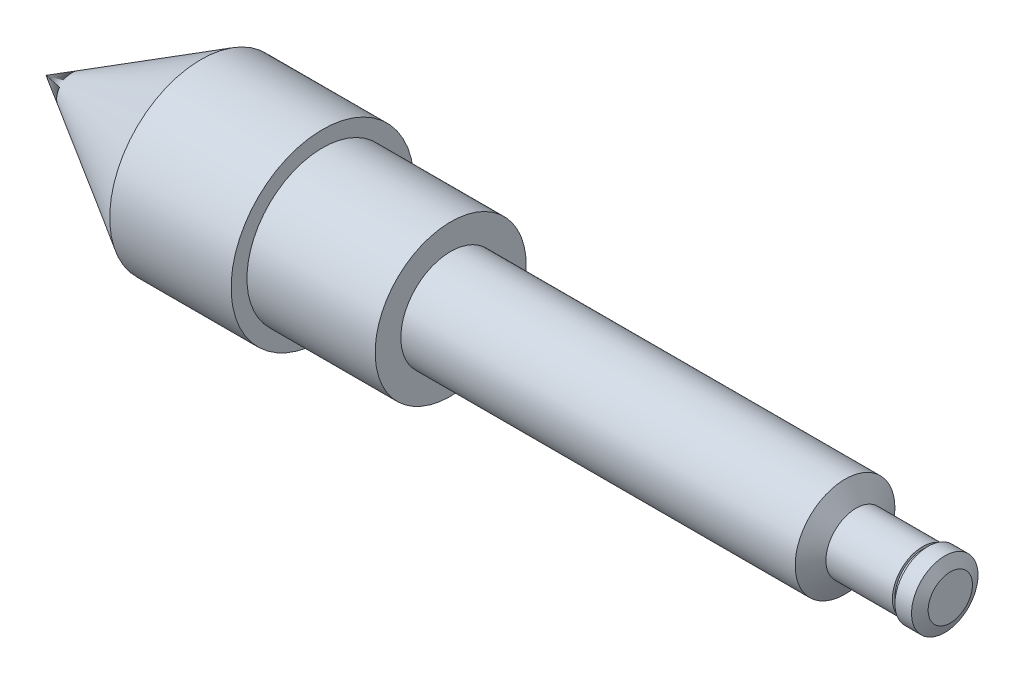
ISO-10303-21;
HEADER;
FILE_DESCRIPTION(('STEP AP214'),'2;1');
FILE_NAME('part.step','',(''),(''),'','','');
FILE_SCHEMA(('AUTOMOTIVE_DESIGN { 1 0 10303 214 1 1 1 1 }'));
ENDSEC;
DATA;
#1=APPLICATION_CONTEXT('core data for automotive mechanical design processes');
#2=APPLICATION_PROTOCOL_DEFINITION('international standard','automotive_design',2000,#1);
#3=PRODUCT_CONTEXT('',#1,'mechanical');
#4=PRODUCT('Part','Part','',(#3));
#5=PRODUCT_RELATED_PRODUCT_CATEGORY('part','',(#4));
#6=PRODUCT_DEFINITION_FORMATION('','',#4);
#7=PRODUCT_DEFINITION_CONTEXT('part definition',#1,'design');
#8=PRODUCT_DEFINITION('design','',#6,#7);
#9=PRODUCT_DEFINITION_SHAPE('','',#8);
#10=(LENGTH_UNIT() NAMED_UNIT(*) SI_UNIT(.MILLI.,.METRE.));
#11=(NAMED_UNIT(*) PLANE_ANGLE_UNIT() SI_UNIT($,.RADIAN.));
#12=(NAMED_UNIT(*) SI_UNIT($,.STERADIAN.) SOLID_ANGLE_UNIT());
#13=UNCERTAINTY_MEASURE_WITH_UNIT(LENGTH_MEASURE(1.E-05),#10,'distance_accuracy_value','');
#14=(GEOMETRIC_REPRESENTATION_CONTEXT(3) GLOBAL_UNCERTAINTY_ASSIGNED_CONTEXT((#13)) GLOBAL_UNIT_ASSIGNED_CONTEXT((#10,
#11,#12)) REPRESENTATION_CONTEXT('',''));
#15=CARTESIAN_POINT('',(0.,0.,0.));
#16=DIRECTION('',(0.,0.,1.));
#17=DIRECTION('',(1.,0.,0.));
#18=AXIS2_PLACEMENT_3D('',#15,#16,#17);
#19=CARTESIAN_POINT('',(148.75,0.,0.));
#20=DIRECTION('',(1.,0.,0.));
#21=DIRECTION('',(0.,0.,-1.));
#22=AXIS2_PLACEMENT_3D('',#19,#20,#21);
#23=CYLINDRICAL_SURFACE('',#22,18.15);
#24=CARTESIAN_POINT('',(24.1,0.,0.));
#25=DIRECTION('',(1.,0.,0.));
#26=DIRECTION('',(0.,0.,-1.));
#27=AXIS2_PLACEMENT_3D('',#24,#25,#26);
#28=CIRCLE('',#27,18.15);
#29=CARTESIAN_POINT('',(24.1,0.,-18.15));
#30=VERTEX_POINT('',#29);
#31=EDGE_CURVE('E11',#30,#30,#28,.T.);
#32=ORIENTED_EDGE('',*,*,#31,.F.);
#33=EDGE_LOOP('',(#32));
#34=FACE_BOUND('',#33,.T.);
#35=CARTESIAN_POINT('',(0.,0.,0.));
#36=DIRECTION('',(1.,0.,0.));
#37=DIRECTION('',(0.,0.,-1.));
#38=AXIS2_PLACEMENT_3D('',#35,#36,#37);
#39=CIRCLE('',#38,18.15);
#40=CARTESIAN_POINT('',(0.,0.,-18.15));
#41=VERTEX_POINT('',#40);
#42=EDGE_CURVE('E67',#41,#41,#39,.T.);
#43=ORIENTED_EDGE('',*,*,#42,.T.);
#44=EDGE_LOOP('',(#43));
#45=FACE_BOUND('',#44,.T.);
#46=ADVANCED_FACE('F35',(#34,#45),#23,.T.);
#47=CARTESIAN_POINT('',(24.1,0.,18.15));
#48=DIRECTION('',(-1.,0.,0.));
#49=DIRECTION('',(0.,0.,1.));
#50=AXIS2_PLACEMENT_3D('',#47,#48,#49);
#51=PLANE('',#50);
#52=CARTESIAN_POINT('',(24.1,0.,0.));
#53=DIRECTION('',(1.,0.,0.));
#54=DIRECTION('',(0.,0.,-1.));
#55=AXIS2_PLACEMENT_3D('',#52,#53,#54);
#56=CIRCLE('',#55,15.);
#57=CARTESIAN_POINT('',(24.1,0.,-15.));
#58=VERTEX_POINT('',#57);
#59=EDGE_CURVE('E41',#58,#58,#56,.T.);
#60=ORIENTED_EDGE('',*,*,#59,.F.);
#61=EDGE_LOOP('',(#60));
#62=FACE_BOUND('',#61,.T.);
#63=ORIENTED_EDGE('',*,*,#31,.T.);
#64=EDGE_LOOP('',(#63));
#65=FACE_BOUND('',#64,.T.);
#66=ADVANCED_FACE('F57',(#62,#65),#51,.F.);
#67=CARTESIAN_POINT('',(148.75,0.,0.));
#68=DIRECTION('',(1.,0.,0.));
#69=DIRECTION('',(0.,0.,-1.));
#70=AXIS2_PLACEMENT_3D('',#67,#68,#69);
#71=CYLINDRICAL_SURFACE('',#70,15.);
#72=CARTESIAN_POINT('',(49.55,0.,0.));
#73=DIRECTION('',(1.,0.,0.));
#74=DIRECTION('',(0.,0.,-1.));
#75=AXIS2_PLACEMENT_3D('',#72,#73,#74);
#76=CIRCLE('',#75,15.);
#77=CARTESIAN_POINT('',(49.55,0.,-15.));
#78=VERTEX_POINT('',#77);
#79=EDGE_CURVE('E97',#78,#78,#76,.T.);
#80=ORIENTED_EDGE('',*,*,#79,.F.);
#81=EDGE_LOOP('',(#80));
#82=FACE_BOUND('',#81,.T.);
#83=ORIENTED_EDGE('',*,*,#59,.T.);
#84=EDGE_LOOP('',(#83));
#85=FACE_BOUND('',#84,.T.);
#86=ADVANCED_FACE('F62',(#82,#85),#71,.T.);
#87=CARTESIAN_POINT('',(49.55,0.,9.90000000000004));
#88=DIRECTION('',(-1.,0.,0.));
#89=DIRECTION('',(0.,0.,1.));
#90=AXIS2_PLACEMENT_3D('',#87,#88,#89);
#91=PLANE('',#90);
#92=CARTESIAN_POINT('',(49.55,0.,0.));
#93=DIRECTION('',(1.,0.,0.));
#94=DIRECTION('',(0.,0.,-1.));
#95=AXIS2_PLACEMENT_3D('',#92,#93,#94);
#96=CIRCLE('',#95,9.90000000000004);
#97=CARTESIAN_POINT('',(49.55,0.,-9.90000000000004));
#98=VERTEX_POINT('',#97);
#99=EDGE_CURVE('E94',#98,#98,#96,.T.);
#100=ORIENTED_EDGE('',*,*,#99,.F.);
#101=EDGE_LOOP('',(#100));
#102=FACE_BOUND('',#101,.T.);
#103=ORIENTED_EDGE('',*,*,#79,.T.);
#104=EDGE_LOOP('',(#103));
#105=FACE_BOUND('',#104,.T.);
#106=ADVANCED_FACE('F104',(#102,#105),#91,.F.);
#107=CARTESIAN_POINT('',(148.75,0.,0.));
#108=DIRECTION('',(1.,0.,0.));
#109=DIRECTION('',(0.,0.,-1.));
#110=AXIS2_PLACEMENT_3D('',#107,#108,#109);
#111=CYLINDRICAL_SURFACE('',#110,9.90000000000004);
#112=CARTESIAN_POINT('',(127.85,0.,0.));
#113=DIRECTION('',(1.,0.,0.));
#114=DIRECTION('',(0.,0.,-1.));
#115=AXIS2_PLACEMENT_3D('',#112,#113,#114);
#116=CIRCLE('',#115,9.90000000000004);
#117=CARTESIAN_POINT('',(127.85,0.,-9.90000000000004));
#118=VERTEX_POINT('',#117);
#119=EDGE_CURVE('E91',#118,#118,#116,.T.);
#120=ORIENTED_EDGE('',*,*,#119,.F.);
#121=EDGE_LOOP('',(#120));
#122=FACE_BOUND('',#121,.T.);
#123=ORIENTED_EDGE('',*,*,#99,.T.);
#124=EDGE_LOOP('',(#123));
#125=FACE_BOUND('',#124,.T.);
#126=ADVANCED_FACE('F110',(#122,#125),#111,.T.);
#127=CARTESIAN_POINT('',(127.85,0.,0.));
#128=DIRECTION('',(-1.,0.,0.));
#129=DIRECTION('',(0.,0.,1.));
#130=AXIS2_PLACEMENT_3D('',#127,#128,#129);
#131=CONICAL_SURFACE('',#130,9.90000000000004,1.05719032207216);
#132=CARTESIAN_POINT('',(130.05,0.,0.));
#133=DIRECTION('',(1.,0.,0.));
#134=DIRECTION('',(0.,0.,-1.));
#135=AXIS2_PLACEMENT_3D('',#132,#133,#134);
#136=CIRCLE('',#135,6.);
#137=CARTESIAN_POINT('',(130.05,0.,-6.));
#138=VERTEX_POINT('',#137);
#139=EDGE_CURVE('E88',#138,#138,#136,.T.);
#140=ORIENTED_EDGE('',*,*,#139,.F.);
#141=EDGE_LOOP('',(#140));
#142=FACE_BOUND('',#141,.T.);
#143=ORIENTED_EDGE('',*,*,#119,.T.);
#144=EDGE_LOOP('',(#143));
#145=FACE_BOUND('',#144,.T.);
#146=ADVANCED_FACE('F117',(#142,#145),#131,.T.);
#147=CARTESIAN_POINT('',(148.75,0.,0.));
#148=DIRECTION('',(1.,0.,0.));
#149=DIRECTION('',(0.,0.,-1.));
#150=AXIS2_PLACEMENT_3D('',#147,#148,#149);
#151=CYLINDRICAL_SURFACE('',#150,6.);
#152=CARTESIAN_POINT('',(143.25,0.,0.));
#153=DIRECTION('',(1.,0.,0.));
#154=DIRECTION('',(0.,0.,-1.));
#155=AXIS2_PLACEMENT_3D('',#152,#153,#154);
#156=CIRCLE('',#155,6.);
#157=CARTESIAN_POINT('',(143.25,0.,-6.));
#158=VERTEX_POINT('',#157);
#159=EDGE_CURVE('E85',#158,#158,#156,.T.);
#160=ORIENTED_EDGE('',*,*,#159,.F.);
#161=EDGE_LOOP('',(#160));
#162=FACE_BOUND('',#161,.T.);
#163=ORIENTED_EDGE('',*,*,#139,.T.);
#164=EDGE_LOOP('',(#163));
#165=FACE_BOUND('',#164,.T.);
#166=ADVANCED_FACE('F121',(#162,#165),#151,.T.);
#167=CARTESIAN_POINT('',(143.25,0.,6.));
#168=DIRECTION('',(-1.,0.,0.));
#169=DIRECTION('',(0.,0.,1.));
#170=AXIS2_PLACEMENT_3D('',#167,#168,#169);
#171=PLANE('',#170);
#172=CARTESIAN_POINT('',(143.25,0.,0.));
#173=DIRECTION('',(1.,0.,0.));
#174=DIRECTION('',(0.,0.,-1.));
#175=AXIS2_PLACEMENT_3D('',#172,#173,#174);
#176=CIRCLE('',#175,5.5);
#177=CARTESIAN_POINT('',(143.25,0.,-5.5));
#178=VERTEX_POINT('',#177);
#179=EDGE_CURVE('E82',#178,#178,#176,.T.);
#180=ORIENTED_EDGE('',*,*,#179,.F.);
#181=EDGE_LOOP('',(#180));
#182=FACE_BOUND('',#181,.T.);
#183=ORIENTED_EDGE('',*,*,#159,.T.);
#184=EDGE_LOOP('',(#183));
#185=FACE_BOUND('',#184,.T.);
#186=ADVANCED_FACE('F125',(#182,#185),#171,.F.);
#187=CARTESIAN_POINT('',(148.75,0.,0.));
#188=DIRECTION('',(1.,0.,0.));
#189=DIRECTION('',(0.,0.,-1.));
#190=AXIS2_PLACEMENT_3D('',#187,#188,#189);
#191=CYLINDRICAL_SURFACE('',#190,5.5);
#192=CARTESIAN_POINT('',(144.35,0.,0.));
#193=DIRECTION('',(1.,0.,0.));
#194=DIRECTION('',(0.,0.,-1.));
#195=AXIS2_PLACEMENT_3D('',#192,#193,#194);
#196=CIRCLE('',#195,5.5);
#197=CARTESIAN_POINT('',(144.35,0.,-5.5));
#198=VERTEX_POINT('',#197);
#199=EDGE_CURVE('E79',#198,#198,#196,.T.);
#200=ORIENTED_EDGE('',*,*,#199,.F.);
#201=EDGE_LOOP('',(#200));
#202=FACE_BOUND('',#201,.T.);
#203=ORIENTED_EDGE('',*,*,#179,.T.);
#204=EDGE_LOOP('',(#203));
#205=FACE_BOUND('',#204,.T.);
#206=ADVANCED_FACE('F129',(#202,#205),#191,.T.);
#207=CARTESIAN_POINT('',(144.35,0.,5.5));
#208=DIRECTION('',(1.,0.,0.));
#209=DIRECTION('',(0.,0.,-1.));
#210=AXIS2_PLACEMENT_3D('',#207,#208,#209);
#211=PLANE('',#210);
#212=CARTESIAN_POINT('',(144.35,0.,0.));
#213=DIRECTION('',(1.,0.,0.));
#214=DIRECTION('',(0.,0.,-1.));
#215=AXIS2_PLACEMENT_3D('',#212,#213,#214);
#216=CIRCLE('',#215,6.6);
#217=CARTESIAN_POINT('',(144.35,0.,-6.6));
#218=VERTEX_POINT('',#217);
#219=EDGE_CURVE('E76',#218,#218,#216,.T.);
#220=ORIENTED_EDGE('',*,*,#219,.F.);
#221=EDGE_LOOP('',(#220));
#222=FACE_BOUND('',#221,.T.);
#223=ORIENTED_EDGE('',*,*,#199,.T.);
#224=EDGE_LOOP('',(#223));
#225=FACE_BOUND('',#224,.T.);
#226=ADVANCED_FACE('F133',(#222,#225),#211,.F.);
#227=CARTESIAN_POINT('',(148.75,0.,0.));
#228=DIRECTION('',(1.,0.,0.));
#229=DIRECTION('',(0.,0.,-1.));
#230=AXIS2_PLACEMENT_3D('',#227,#228,#229);
#231=CYLINDRICAL_SURFACE('',#230,6.6);
#232=CARTESIAN_POINT('',(147.65,0.,0.));
#233=DIRECTION('',(1.,0.,0.));
#234=DIRECTION('',(0.,0.,-1.));
#235=AXIS2_PLACEMENT_3D('',#232,#233,#234);
#236=CIRCLE('',#235,6.6);
#237=CARTESIAN_POINT('',(147.65,0.,-6.6));
#238=VERTEX_POINT('',#237);
#239=EDGE_CURVE('E71',#238,#238,#236,.T.);
#240=ORIENTED_EDGE('',*,*,#239,.F.);
#241=EDGE_LOOP('',(#240));
#242=FACE_BOUND('',#241,.T.);
#243=ORIENTED_EDGE('',*,*,#219,.T.);
#244=EDGE_LOOP('',(#243));
#245=FACE_BOUND('',#244,.T.);
#246=ADVANCED_FACE('F137',(#242,#245),#231,.T.);
#247=CARTESIAN_POINT('',(147.65,0.,0.));
#248=DIRECTION('',(-1.,0.,0.));
#249=DIRECTION('',(0.,0.,1.));
#250=AXIS2_PLACEMENT_3D('',#247,#248,#249);
#251=CONICAL_SURFACE('',#250,6.6,1.10714871779409);
#252=CARTESIAN_POINT('',(148.75,0.,0.));
#253=DIRECTION('',(1.,0.,0.));
#254=DIRECTION('',(0.,0.,-1.));
#255=AXIS2_PLACEMENT_3D('',#252,#253,#254);
#256=CIRCLE('',#255,4.4);
#257=CARTESIAN_POINT('',(148.75,0.,-4.4));
#258=VERTEX_POINT('',#257);
#259=EDGE_CURVE('E68',#258,#258,#256,.T.);
#260=ORIENTED_EDGE('',*,*,#259,.F.);
#261=EDGE_LOOP('',(#260));
#262=FACE_BOUND('',#261,.T.);
#263=ORIENTED_EDGE('',*,*,#239,.T.);
#264=EDGE_LOOP('',(#263));
#265=FACE_BOUND('',#264,.T.);
#266=ADVANCED_FACE('F52',(#262,#265),#251,.T.);
#267=CARTESIAN_POINT('',(148.75,0.,4.4));
#268=DIRECTION('',(-1.,0.,0.));
#269=DIRECTION('',(0.,0.,1.));
#270=AXIS2_PLACEMENT_3D('',#267,#268,#269);
#271=PLANE('',#270);
#272=ORIENTED_EDGE('',*,*,#259,.T.);
#273=EDGE_LOOP('',(#272));
#274=FACE_BOUND('',#273,.T.);
#275=ADVANCED_FACE('F46',(#274),#271,.F.);
#276=CARTESIAN_POINT('',(-30.8,0.,0.));
#277=DIRECTION('',(1.,0.,0.));
#278=DIRECTION('',(0.,0.,-1.));
#279=AXIS2_PLACEMENT_3D('',#276,#277,#278);
#280=CONICAL_SURFACE('',#279,0.,0.532504098301851);
#281=ORIENTED_EDGE('',*,*,#42,.F.);
#282=EDGE_LOOP('',(#281));
#283=FACE_BOUND('',#282,.T.);
#284=CARTESIAN_POINT('',(-30.8,0.,0.));
#285=VERTEX_POINT('',#284);
#286=VERTEX_LOOP('',#285);
#287=FACE_BOUND('',#286,.T.);
#288=ADVANCED_FACE('F44',(#283,#287),#280,.T.);
#289=CLOSED_SHELL('',(#46,#66,#86,#106,#126,#146,#166,#186,#206,#226,#246,#266,#275,#288));
#290=MANIFOLD_SOLID_BREP('B2',#289);
#291=ADVANCED_BREP_SHAPE_REPRESENTATION('',(#18,#290),#14);
#292=SHAPE_DEFINITION_REPRESENTATION(#9,#291);
ENDSEC;
END-ISO-10303-21;
